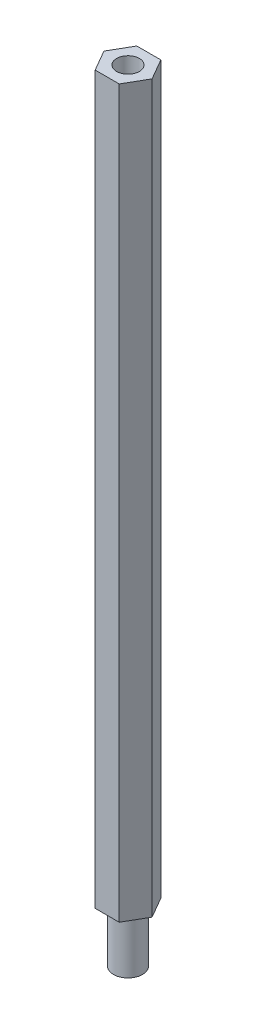
ISO-10303-21;
HEADER;
FILE_DESCRIPTION(('STEP AP214'),'2;1');
FILE_NAME('part.step','',(''),(''),'','','');
FILE_SCHEMA(('AUTOMOTIVE_DESIGN { 1 0 10303 214 1 1 1 1 }'));
ENDSEC;
DATA;
#1=APPLICATION_CONTEXT('core data for automotive mechanical design processes');
#2=APPLICATION_PROTOCOL_DEFINITION('international standard','automotive_design',2000,#1);
#3=PRODUCT_CONTEXT('',#1,'mechanical');
#4=PRODUCT('Part','Part','',(#3));
#5=PRODUCT_RELATED_PRODUCT_CATEGORY('part','',(#4));
#6=PRODUCT_DEFINITION_FORMATION('','',#4);
#7=PRODUCT_DEFINITION_CONTEXT('part definition',#1,'design');
#8=PRODUCT_DEFINITION('design','',#6,#7);
#9=PRODUCT_DEFINITION_SHAPE('','',#8);
#10=(LENGTH_UNIT() NAMED_UNIT(*) SI_UNIT(.MILLI.,.METRE.));
#11=(NAMED_UNIT(*) PLANE_ANGLE_UNIT() SI_UNIT($,.RADIAN.));
#12=(NAMED_UNIT(*) SI_UNIT($,.STERADIAN.) SOLID_ANGLE_UNIT());
#13=UNCERTAINTY_MEASURE_WITH_UNIT(LENGTH_MEASURE(1.E-05),#10,'distance_accuracy_value','');
#14=(GEOMETRIC_REPRESENTATION_CONTEXT(3) GLOBAL_UNCERTAINTY_ASSIGNED_CONTEXT((#13)) GLOBAL_UNIT_ASSIGNED_CONTEXT((#10,
#11,#12)) REPRESENTATION_CONTEXT('',''));
#15=CARTESIAN_POINT('',(0.,0.,0.));
#16=DIRECTION('',(0.,0.,1.));
#17=DIRECTION('',(1.,0.,0.));
#18=AXIS2_PLACEMENT_3D('',#15,#16,#17);
#19=CARTESIAN_POINT('',(-1.325,80.,2.29496732002876));
#20=DIRECTION('',(0.,0.,-1.));
#21=DIRECTION('',(-1.,0.,0.));
#22=AXIS2_PLACEMENT_3D('',#19,#20,#21);
#23=PLANE('',#22);
#24=DIRECTION('',(1.,0.,0.));
#25=VECTOR('',#24,1.);
#26=CARTESIAN_POINT('',(-1.325,0.,2.29496732002876));
#27=LINE('',#26,#25);
#28=CARTESIAN_POINT('',(-1.325,0.,2.29496732002876));
#29=VERTEX_POINT('',#28);
#30=CARTESIAN_POINT('',(1.325,0.,2.29496732002876));
#31=VERTEX_POINT('',#30);
#32=EDGE_CURVE('E122',#29,#31,#27,.T.);
#33=ORIENTED_EDGE('',*,*,#32,.T.);
#34=DIRECTION('',(0.,-1.,0.));
#35=VECTOR('',#34,1.);
#36=CARTESIAN_POINT('',(1.325,80.,2.29496732002876));
#37=LINE('',#36,#35);
#38=CARTESIAN_POINT('',(1.325,80.,2.29496732002876));
#39=VERTEX_POINT('',#38);
#40=EDGE_CURVE('E45',#39,#31,#37,.T.);
#41=ORIENTED_EDGE('',*,*,#40,.F.);
#42=DIRECTION('',(1.,0.,0.));
#43=VECTOR('',#42,1.);
#44=CARTESIAN_POINT('',(-1.325,80.,2.29496732002876));
#45=LINE('',#44,#43);
#46=CARTESIAN_POINT('',(-1.325,80.,2.29496732002876));
#47=VERTEX_POINT('',#46);
#48=EDGE_CURVE('E133',#47,#39,#45,.T.);
#49=ORIENTED_EDGE('',*,*,#48,.F.);
#50=DIRECTION('',(0.,-1.,0.));
#51=VECTOR('',#50,1.);
#52=CARTESIAN_POINT('',(-1.325,80.,2.29496732002876));
#53=LINE('',#52,#51);
#54=EDGE_CURVE('E118',#47,#29,#53,.T.);
#55=ORIENTED_EDGE('',*,*,#54,.T.);
#56=EDGE_LOOP('',(#33,#41,#49,#55));
#57=FACE_BOUND('',#56,.T.);
#58=ADVANCED_FACE('F37',(#57),#23,.F.);
#59=CARTESIAN_POINT('',(1.325,80.,2.29496732002876));
#60=DIRECTION('',(-0.866025403784439,0.,-0.5));
#61=DIRECTION('',(-0.5,0.,0.866025403784439));
#62=AXIS2_PLACEMENT_3D('',#59,#60,#61);
#63=PLANE('',#62);
#64=DIRECTION('',(0.5,0.,-0.866025403784439));
#65=VECTOR('',#64,1.);
#66=CARTESIAN_POINT('',(1.325,0.,2.29496732002876));
#67=LINE('',#66,#65);
#68=CARTESIAN_POINT('',(2.65,0.,0.));
#69=VERTEX_POINT('',#68);
#70=EDGE_CURVE('E125',#31,#69,#67,.T.);
#71=ORIENTED_EDGE('',*,*,#70,.T.);
#72=DIRECTION('',(0.,-1.,0.));
#73=VECTOR('',#72,1.);
#74=CARTESIAN_POINT('',(2.65,80.,0.));
#75=LINE('',#74,#73);
#76=CARTESIAN_POINT('',(2.65,80.,0.));
#77=VERTEX_POINT('',#76);
#78=EDGE_CURVE('E137',#77,#69,#75,.T.);
#79=ORIENTED_EDGE('',*,*,#78,.F.);
#80=DIRECTION('',(0.5,0.,-0.866025403784439));
#81=VECTOR('',#80,1.);
#82=CARTESIAN_POINT('',(1.325,80.,2.29496732002876));
#83=LINE('',#82,#81);
#84=EDGE_CURVE('E91',#39,#77,#83,.T.);
#85=ORIENTED_EDGE('',*,*,#84,.F.);
#86=ORIENTED_EDGE('',*,*,#40,.T.);
#87=EDGE_LOOP('',(#71,#79,#85,#86));
#88=FACE_BOUND('',#87,.T.);
#89=ADVANCED_FACE('F140',(#88),#63,.F.);
#90=CARTESIAN_POINT('',(2.65,80.,0.));
#91=DIRECTION('',(-0.866025403784438,0.,0.5));
#92=DIRECTION('',(0.5,0.,0.866025403784439));
#93=AXIS2_PLACEMENT_3D('',#90,#91,#92);
#94=PLANE('',#93);
#95=DIRECTION('',(-0.5,0.,-0.866025403784439));
#96=VECTOR('',#95,1.);
#97=CARTESIAN_POINT('',(2.65,0.,0.));
#98=LINE('',#97,#96);
#99=CARTESIAN_POINT('',(1.325,0.,-2.29496732002876));
#100=VERTEX_POINT('',#99);
#101=EDGE_CURVE('E128',#69,#100,#98,.T.);
#102=ORIENTED_EDGE('',*,*,#101,.T.);
#103=DIRECTION('',(0.,-1.,0.));
#104=VECTOR('',#103,1.);
#105=CARTESIAN_POINT('',(1.325,80.,-2.29496732002876));
#106=LINE('',#105,#104);
#107=CARTESIAN_POINT('',(1.325,80.,-2.29496732002876));
#108=VERTEX_POINT('',#107);
#109=EDGE_CURVE('E113',#108,#100,#106,.T.);
#110=ORIENTED_EDGE('',*,*,#109,.F.);
#111=DIRECTION('',(-0.5,0.,-0.866025403784439));
#112=VECTOR('',#111,1.);
#113=CARTESIAN_POINT('',(2.65,80.,0.));
#114=LINE('',#113,#112);
#115=EDGE_CURVE('E104',#77,#108,#114,.T.);
#116=ORIENTED_EDGE('',*,*,#115,.F.);
#117=ORIENTED_EDGE('',*,*,#78,.T.);
#118=EDGE_LOOP('',(#102,#110,#116,#117));
#119=FACE_BOUND('',#118,.T.);
#120=ADVANCED_FACE('F148',(#119),#94,.F.);
#121=CARTESIAN_POINT('',(1.325,80.,-2.29496732002876));
#122=DIRECTION('',(0.,0.,1.));
#123=DIRECTION('',(1.,0.,0.));
#124=AXIS2_PLACEMENT_3D('',#121,#122,#123);
#125=PLANE('',#124);
#126=DIRECTION('',(-1.,0.,0.));
#127=VECTOR('',#126,1.);
#128=CARTESIAN_POINT('',(1.325,0.,-2.29496732002876));
#129=LINE('',#128,#127);
#130=CARTESIAN_POINT('',(-1.325,0.,-2.29496732002876));
#131=VERTEX_POINT('',#130);
#132=EDGE_CURVE('E112',#100,#131,#129,.T.);
#133=ORIENTED_EDGE('',*,*,#132,.T.);
#134=DIRECTION('',(0.,-1.,0.));
#135=VECTOR('',#134,1.);
#136=CARTESIAN_POINT('',(-1.325,80.,-2.29496732002876));
#137=LINE('',#136,#135);
#138=CARTESIAN_POINT('',(-1.325,80.,-2.29496732002876));
#139=VERTEX_POINT('',#138);
#140=EDGE_CURVE('E109',#139,#131,#137,.T.);
#141=ORIENTED_EDGE('',*,*,#140,.F.);
#142=DIRECTION('',(-1.,0.,0.));
#143=VECTOR('',#142,1.);
#144=CARTESIAN_POINT('',(1.325,80.,-2.29496732002876));
#145=LINE('',#144,#143);
#146=EDGE_CURVE('E98',#108,#139,#145,.T.);
#147=ORIENTED_EDGE('',*,*,#146,.F.);
#148=ORIENTED_EDGE('',*,*,#109,.T.);
#149=EDGE_LOOP('',(#133,#141,#147,#148));
#150=FACE_BOUND('',#149,.T.);
#151=ADVANCED_FACE('F110',(#150),#125,.F.);
#152=CARTESIAN_POINT('',(-1.325,80.,-2.29496732002876));
#153=DIRECTION('',(0.866025403784439,0.,0.5));
#154=DIRECTION('',(0.5,0.,-0.866025403784439));
#155=AXIS2_PLACEMENT_3D('',#152,#153,#154);
#156=PLANE('',#155);
#157=DIRECTION('',(-0.5,0.,0.866025403784439));
#158=VECTOR('',#157,1.);
#159=CARTESIAN_POINT('',(-1.325,0.,-2.29496732002876));
#160=LINE('',#159,#158);
#161=CARTESIAN_POINT('',(-2.65,0.,0.));
#162=VERTEX_POINT('',#161);
#163=EDGE_CURVE('E76',#131,#162,#160,.T.);
#164=ORIENTED_EDGE('',*,*,#163,.T.);
#165=DIRECTION('',(0.,-1.,0.));
#166=VECTOR('',#165,1.);
#167=CARTESIAN_POINT('',(-2.65,80.,0.));
#168=LINE('',#167,#166);
#169=CARTESIAN_POINT('',(-2.65,80.,0.));
#170=VERTEX_POINT('',#169);
#171=EDGE_CURVE('E114',#170,#162,#168,.T.);
#172=ORIENTED_EDGE('',*,*,#171,.F.);
#173=DIRECTION('',(-0.5,0.,0.866025403784439));
#174=VECTOR('',#173,1.);
#175=CARTESIAN_POINT('',(-1.325,80.,-2.29496732002876));
#176=LINE('',#175,#174);
#177=EDGE_CURVE('E102',#139,#170,#176,.T.);
#178=ORIENTED_EDGE('',*,*,#177,.F.);
#179=ORIENTED_EDGE('',*,*,#140,.T.);
#180=EDGE_LOOP('',(#164,#172,#178,#179));
#181=FACE_BOUND('',#180,.T.);
#182=ADVANCED_FACE('F116',(#181),#156,.F.);
#183=CARTESIAN_POINT('',(-2.65,80.,0.));
#184=DIRECTION('',(0.866025403784438,0.,-0.5));
#185=DIRECTION('',(-0.5,0.,-0.866025403784439));
#186=AXIS2_PLACEMENT_3D('',#183,#184,#185);
#187=PLANE('',#186);
#188=DIRECTION('',(0.5,0.,0.866025403784439));
#189=VECTOR('',#188,1.);
#190=CARTESIAN_POINT('',(-2.65,0.,0.));
#191=LINE('',#190,#189);
#192=EDGE_CURVE('E82',#162,#29,#191,.T.);
#193=ORIENTED_EDGE('',*,*,#192,.T.);
#194=ORIENTED_EDGE('',*,*,#54,.F.);
#195=DIRECTION('',(0.5,0.,0.866025403784439));
#196=VECTOR('',#195,1.);
#197=CARTESIAN_POINT('',(-2.65,80.,0.));
#198=LINE('',#197,#196);
#199=EDGE_CURVE('E53',#170,#47,#198,.T.);
#200=ORIENTED_EDGE('',*,*,#199,.F.);
#201=ORIENTED_EDGE('',*,*,#171,.T.);
#202=EDGE_LOOP('',(#193,#194,#200,#201));
#203=FACE_BOUND('',#202,.T.);
#204=ADVANCED_FACE('F171',(#203),#187,.F.);
#205=CARTESIAN_POINT('',(0.,80.,0.));
#206=DIRECTION('',(0.,1.,0.));
#207=DIRECTION('',(0.,0.,1.));
#208=AXIS2_PLACEMENT_3D('',#205,#206,#207);
#209=PLANE('',#208);
#210=CARTESIAN_POINT('',(0.,80.,0.));
#211=DIRECTION('',(0.,1.,0.));
#212=DIRECTION('',(0.,0.,1.));
#213=AXIS2_PLACEMENT_3D('',#210,#211,#212);
#214=CIRCLE('',#213,1.25);
#215=CARTESIAN_POINT('',(0.,80.,1.25));
#216=VERTEX_POINT('',#215);
#217=EDGE_CURVE('E155',#216,#216,#214,.T.);
#218=ORIENTED_EDGE('',*,*,#217,.F.);
#219=EDGE_LOOP('',(#218));
#220=FACE_BOUND('',#219,.T.);
#221=ORIENTED_EDGE('',*,*,#48,.T.);
#222=ORIENTED_EDGE('',*,*,#84,.T.);
#223=ORIENTED_EDGE('',*,*,#115,.T.);
#224=ORIENTED_EDGE('',*,*,#146,.T.);
#225=ORIENTED_EDGE('',*,*,#177,.T.);
#226=ORIENTED_EDGE('',*,*,#199,.T.);
#227=EDGE_LOOP('',(#221,#222,#223,#224,#225,#226));
#228=FACE_BOUND('',#227,.T.);
#229=ADVANCED_FACE('F100',(#220,#228),#209,.T.);
#230=CARTESIAN_POINT('',(0.,0.,0.));
#231=DIRECTION('',(0.,1.,0.));
#232=DIRECTION('',(0.,0.,1.));
#233=AXIS2_PLACEMENT_3D('',#230,#231,#232);
#234=PLANE('',#233);
#235=CARTESIAN_POINT('',(0.,0.,0.));
#236=DIRECTION('',(0.,1.,0.));
#237=DIRECTION('',(0.,0.,1.));
#238=AXIS2_PLACEMENT_3D('',#235,#236,#237);
#239=CIRCLE('',#238,1.6);
#240=CARTESIAN_POINT('',(0.,0.,1.6));
#241=VERTEX_POINT('',#240);
#242=EDGE_CURVE('E11',#241,#241,#239,.F.);
#243=ORIENTED_EDGE('',*,*,#242,.F.);
#244=EDGE_LOOP('',(#243));
#245=FACE_BOUND('',#244,.T.);
#246=ORIENTED_EDGE('',*,*,#32,.F.);
#247=ORIENTED_EDGE('',*,*,#192,.F.);
#248=ORIENTED_EDGE('',*,*,#163,.F.);
#249=ORIENTED_EDGE('',*,*,#132,.F.);
#250=ORIENTED_EDGE('',*,*,#101,.F.);
#251=ORIENTED_EDGE('',*,*,#70,.F.);
#252=EDGE_LOOP('',(#246,#247,#248,#249,#250,#251));
#253=FACE_BOUND('',#252,.T.);
#254=ADVANCED_FACE('F145',(#245,#253),#234,.F.);
#255=CARTESIAN_POINT('',(0.,-6.,0.));
#256=DIRECTION('',(0.,1.,0.));
#257=DIRECTION('',(0.,0.,1.));
#258=AXIS2_PLACEMENT_3D('',#255,#256,#257);
#259=CYLINDRICAL_SURFACE('',#258,1.6);
#260=CARTESIAN_POINT('',(0.,-6.,0.));
#261=DIRECTION('',(0.,-1.,0.));
#262=DIRECTION('',(0.,0.,-1.));
#263=AXIS2_PLACEMENT_3D('',#260,#261,#262);
#264=CIRCLE('',#263,1.6);
#265=CARTESIAN_POINT('',(0.,-6.,-1.6));
#266=VERTEX_POINT('',#265);
#267=EDGE_CURVE('E126',#266,#266,#264,.T.);
#268=ORIENTED_EDGE('',*,*,#267,.F.);
#269=EDGE_LOOP('',(#268));
#270=FACE_BOUND('',#269,.T.);
#271=ORIENTED_EDGE('',*,*,#242,.T.);
#272=EDGE_LOOP('',(#271));
#273=FACE_BOUND('',#272,.T.);
#274=ADVANCED_FACE('F177',(#270,#273),#259,.T.);
#275=CARTESIAN_POINT('',(0.,-6.,0.));
#276=DIRECTION('',(0.,-1.,0.));
#277=DIRECTION('',(0.,0.,-1.));
#278=AXIS2_PLACEMENT_3D('',#275,#276,#277);
#279=PLANE('',#278);
#280=ORIENTED_EDGE('',*,*,#267,.T.);
#281=EDGE_LOOP('',(#280));
#282=FACE_BOUND('',#281,.T.);
#283=ADVANCED_FACE('F166',(#282),#279,.T.);
#284=CARTESIAN_POINT('',(0.,75.,0.));
#285=DIRECTION('',(0.,1.,0.));
#286=DIRECTION('',(0.,0.,1.));
#287=AXIS2_PLACEMENT_3D('',#284,#285,#286);
#288=CYLINDRICAL_SURFACE('',#287,1.25);
#289=CARTESIAN_POINT('',(0.,75.,0.));
#290=DIRECTION('',(0.,1.,0.));
#291=DIRECTION('',(0.,0.,1.));
#292=AXIS2_PLACEMENT_3D('',#289,#290,#291);
#293=CIRCLE('',#292,1.25);
#294=CARTESIAN_POINT('',(0.,75.,1.25));
#295=VERTEX_POINT('',#294);
#296=EDGE_CURVE('E154',#295,#295,#293,.T.);
#297=ORIENTED_EDGE('',*,*,#296,.F.);
#298=EDGE_LOOP('',(#297));
#299=FACE_BOUND('',#298,.T.);
#300=ORIENTED_EDGE('',*,*,#217,.T.);
#301=EDGE_LOOP('',(#300));
#302=FACE_BOUND('',#301,.T.);
#303=ADVANCED_FACE('F163',(#299,#302),#288,.F.);
#304=CARTESIAN_POINT('',(0.,75.,0.));
#305=DIRECTION('',(0.,1.,0.));
#306=DIRECTION('',(0.,0.,1.));
#307=AXIS2_PLACEMENT_3D('',#304,#305,#306);
#308=PLANE('',#307);
#309=ORIENTED_EDGE('',*,*,#296,.T.);
#310=EDGE_LOOP('',(#309));
#311=FACE_BOUND('',#310,.T.);
#312=ADVANCED_FACE('F161',(#311),#308,.T.);
#313=CLOSED_SHELL('',(#58,#89,#120,#151,#182,#204,#229,#254,#274,#283,#303,#312));
#314=MANIFOLD_SOLID_BREP('B2',#313);
#315=ADVANCED_BREP_SHAPE_REPRESENTATION('',(#18,#314),#14);
#316=SHAPE_DEFINITION_REPRESENTATION(#9,#315);
ENDSEC;
END-ISO-10303-21;
